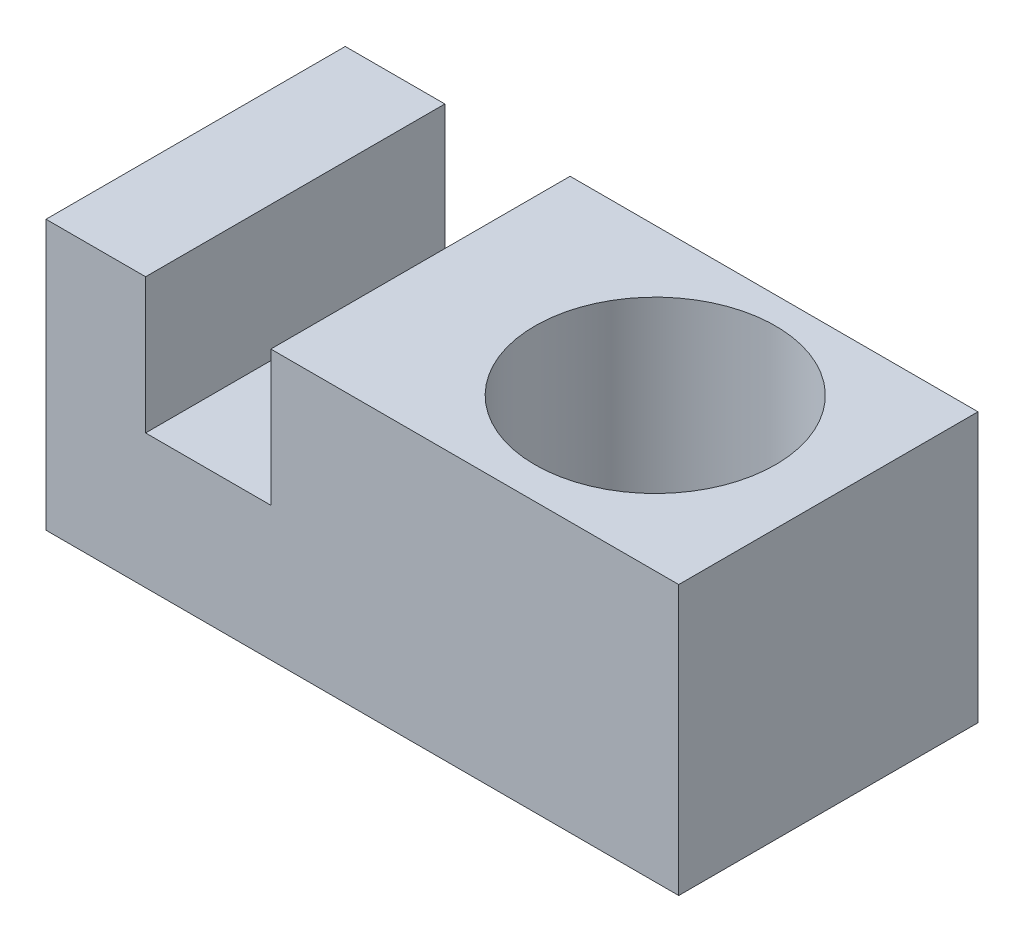
ISO-10303-21;
HEADER;
FILE_DESCRIPTION(('STEP AP214'),'2;1');
FILE_NAME('part.step','',(''),(''),'','','');
FILE_SCHEMA(('AUTOMOTIVE_DESIGN { 1 0 10303 214 1 1 1 1 }'));
ENDSEC;
DATA;
#1=APPLICATION_CONTEXT('core data for automotive mechanical design processes');
#2=APPLICATION_PROTOCOL_DEFINITION('international standard','automotive_design',2000,#1);
#3=PRODUCT_CONTEXT('',#1,'mechanical');
#4=PRODUCT('Part','Part','',(#3));
#5=PRODUCT_RELATED_PRODUCT_CATEGORY('part','',(#4));
#6=PRODUCT_DEFINITION_FORMATION('','',#4);
#7=PRODUCT_DEFINITION_CONTEXT('part definition',#1,'design');
#8=PRODUCT_DEFINITION('design','',#6,#7);
#9=PRODUCT_DEFINITION_SHAPE('','',#8);
#10=(LENGTH_UNIT() NAMED_UNIT(*) SI_UNIT(.MILLI.,.METRE.));
#11=(NAMED_UNIT(*) PLANE_ANGLE_UNIT() SI_UNIT($,.RADIAN.));
#12=(NAMED_UNIT(*) SI_UNIT($,.STERADIAN.) SOLID_ANGLE_UNIT());
#13=UNCERTAINTY_MEASURE_WITH_UNIT(LENGTH_MEASURE(1.E-05),#10,'distance_accuracy_value','');
#14=(GEOMETRIC_REPRESENTATION_CONTEXT(3) GLOBAL_UNCERTAINTY_ASSIGNED_CONTEXT((#13)) GLOBAL_UNIT_ASSIGNED_CONTEXT((#10,
#11,#12)) REPRESENTATION_CONTEXT('',''));
#15=CARTESIAN_POINT('',(0.,0.,0.));
#16=DIRECTION('',(0.,0.,1.));
#17=DIRECTION('',(1.,0.,0.));
#18=AXIS2_PLACEMENT_3D('',#15,#16,#17);
#19=CARTESIAN_POINT('',(0.,18.,0.));
#20=DIRECTION('',(0.,-1.,0.));
#21=DIRECTION('',(0.,0.,-1.));
#22=AXIS2_PLACEMENT_3D('',#19,#20,#21);
#23=PLANE('',#22);
#24=DIRECTION('',(1.,0.,0.));
#25=VECTOR('',#24,1.);
#26=CARTESIAN_POINT('',(0.,18.,0.));
#27=LINE('',#26,#25);
#28=CARTESIAN_POINT('',(0.,18.,0.));
#29=VERTEX_POINT('',#28);
#30=CARTESIAN_POINT('',(6.656095268603,18.,0.));
#31=VERTEX_POINT('',#30);
#32=EDGE_CURVE('E87',#29,#31,#27,.T.);
#33=ORIENTED_EDGE('',*,*,#32,.T.);
#34=DIRECTION('',(0.,0.,1.));
#35=VECTOR('',#34,1.);
#36=CARTESIAN_POINT('',(6.656095268603,18.,-20.));
#37=LINE('',#36,#35);
#38=CARTESIAN_POINT('',(6.656095268603,18.,-20.));
#39=VERTEX_POINT('',#38);
#40=EDGE_CURVE('E135',#39,#31,#37,.T.);
#41=ORIENTED_EDGE('',*,*,#40,.F.);
#42=DIRECTION('',(-1.,0.,0.));
#43=VECTOR('',#42,1.);
#44=CARTESIAN_POINT('',(0.,18.,-20.));
#45=LINE('',#44,#43);
#46=CARTESIAN_POINT('',(0.,18.,-20.));
#47=VERTEX_POINT('',#46);
#48=EDGE_CURVE('E58',#39,#47,#45,.T.);
#49=ORIENTED_EDGE('',*,*,#48,.T.);
#50=DIRECTION('',(0.,0.,1.));
#51=VECTOR('',#50,1.);
#52=CARTESIAN_POINT('',(0.,18.,0.));
#53=LINE('',#52,#51);
#54=EDGE_CURVE('E147',#47,#29,#53,.T.);
#55=ORIENTED_EDGE('',*,*,#54,.T.);
#56=EDGE_LOOP('',(#33,#41,#49,#55));
#57=FACE_BOUND('',#56,.T.);
#58=ADVANCED_FACE('F34',(#57),#23,.F.);
#59=CARTESIAN_POINT('',(0.,18.,0.));
#60=DIRECTION('',(1.,0.,0.));
#61=DIRECTION('',(0.,0.,-1.));
#62=AXIS2_PLACEMENT_3D('',#59,#60,#61);
#63=PLANE('',#62);
#64=DIRECTION('',(0.,0.,1.));
#65=VECTOR('',#64,1.);
#66=CARTESIAN_POINT('',(0.,0.,0.));
#67=LINE('',#66,#65);
#68=CARTESIAN_POINT('',(0.,0.,-20.));
#69=VERTEX_POINT('',#68);
#70=CARTESIAN_POINT('',(0.,0.,0.));
#71=VERTEX_POINT('',#70);
#72=EDGE_CURVE('E144',#69,#71,#67,.T.);
#73=ORIENTED_EDGE('',*,*,#72,.T.);
#74=DIRECTION('',(0.,-1.,0.));
#75=VECTOR('',#74,1.);
#76=CARTESIAN_POINT('',(0.,18.,0.));
#77=LINE('',#76,#75);
#78=EDGE_CURVE('E11',#29,#71,#77,.T.);
#79=ORIENTED_EDGE('',*,*,#78,.F.);
#80=ORIENTED_EDGE('',*,*,#54,.F.);
#81=DIRECTION('',(0.,-1.,0.));
#82=VECTOR('',#81,1.);
#83=CARTESIAN_POINT('',(0.,18.,-20.));
#84=LINE('',#83,#82);
#85=EDGE_CURVE('E156',#47,#69,#84,.T.);
#86=ORIENTED_EDGE('',*,*,#85,.T.);
#87=EDGE_LOOP('',(#73,#79,#80,#86));
#88=FACE_BOUND('',#87,.T.);
#89=ADVANCED_FACE('F36',(#88),#63,.F.);
#90=CARTESIAN_POINT('',(0.,18.,0.));
#91=DIRECTION('',(0.,0.,-1.));
#92=DIRECTION('',(-1.,0.,0.));
#93=AXIS2_PLACEMENT_3D('',#90,#91,#92);
#94=PLANE('',#93);
#95=DIRECTION('',(1.,0.,0.));
#96=VECTOR('',#95,1.);
#97=CARTESIAN_POINT('',(6.656095268603,8.95889217596846,0.));
#98=LINE('',#97,#96);
#99=CARTESIAN_POINT('',(6.656095268603,8.95889217596846,0.));
#100=VERTEX_POINT('',#99);
#101=CARTESIAN_POINT('',(15.0247413303417,8.95889217596846,0.));
#102=VERTEX_POINT('',#101);
#103=EDGE_CURVE('E129',#100,#102,#98,.T.);
#104=ORIENTED_EDGE('',*,*,#103,.F.);
#105=DIRECTION('',(0.,-1.,0.));
#106=VECTOR('',#105,1.);
#107=CARTESIAN_POINT('',(6.656095268603,18.,0.));
#108=LINE('',#107,#106);
#109=EDGE_CURVE('E114',#31,#100,#108,.T.);
#110=ORIENTED_EDGE('',*,*,#109,.F.);
#111=ORIENTED_EDGE('',*,*,#32,.F.);
#112=ORIENTED_EDGE('',*,*,#78,.T.);
#113=DIRECTION('',(1.,0.,0.));
#114=VECTOR('',#113,1.);
#115=CARTESIAN_POINT('',(0.,0.,0.));
#116=LINE('',#115,#114);
#117=CARTESIAN_POINT('',(42.2857142857143,0.,0.));
#118=VERTEX_POINT('',#117);
#119=EDGE_CURVE('E159',#71,#118,#116,.T.);
#120=ORIENTED_EDGE('',*,*,#119,.T.);
#121=DIRECTION('',(0.,-1.,0.));
#122=VECTOR('',#121,1.);
#123=CARTESIAN_POINT('',(42.2857142857143,18.,0.));
#124=LINE('',#123,#122);
#125=CARTESIAN_POINT('',(42.2857142857143,18.,0.));
#126=VERTEX_POINT('',#125);
#127=EDGE_CURVE('E42',#126,#118,#124,.T.);
#128=ORIENTED_EDGE('',*,*,#127,.F.);
#129=CARTESIAN_POINT('',(15.0247413303417,18.,0.));
#130=VERTEX_POINT('',#129);
#131=EDGE_CURVE('E149',#130,#126,#27,.T.);
#132=ORIENTED_EDGE('',*,*,#131,.F.);
#133=DIRECTION('',(0.,1.,0.));
#134=VECTOR('',#133,1.);
#135=CARTESIAN_POINT('',(15.0247413303417,18.,0.));
#136=LINE('',#135,#134);
#137=EDGE_CURVE('E49',#102,#130,#136,.T.);
#138=ORIENTED_EDGE('',*,*,#137,.F.);
#139=EDGE_LOOP('',(#104,#110,#111,#112,#120,#128,#132,#138));
#140=FACE_BOUND('',#139,.T.);
#141=ADVANCED_FACE('F180',(#140),#94,.F.);
#142=CARTESIAN_POINT('',(42.2857142857143,18.,0.));
#143=DIRECTION('',(-1.,0.,0.));
#144=DIRECTION('',(0.,0.,1.));
#145=AXIS2_PLACEMENT_3D('',#142,#143,#144);
#146=PLANE('',#145);
#147=DIRECTION('',(0.,0.,-1.));
#148=VECTOR('',#147,1.);
#149=CARTESIAN_POINT('',(42.2857142857143,0.,0.));
#150=LINE('',#149,#148);
#151=CARTESIAN_POINT('',(42.2857142857143,0.,-20.));
#152=VERTEX_POINT('',#151);
#153=EDGE_CURVE('E161',#118,#152,#150,.T.);
#154=ORIENTED_EDGE('',*,*,#153,.T.);
#155=DIRECTION('',(0.,-1.,0.));
#156=VECTOR('',#155,1.);
#157=CARTESIAN_POINT('',(42.2857142857143,18.,-20.));
#158=LINE('',#157,#156);
#159=CARTESIAN_POINT('',(42.2857142857143,18.,-20.));
#160=VERTEX_POINT('',#159);
#161=EDGE_CURVE('E165',#160,#152,#158,.T.);
#162=ORIENTED_EDGE('',*,*,#161,.F.);
#163=DIRECTION('',(0.,0.,-1.));
#164=VECTOR('',#163,1.);
#165=CARTESIAN_POINT('',(42.2857142857143,18.,0.));
#166=LINE('',#165,#164);
#167=EDGE_CURVE('E151',#126,#160,#166,.T.);
#168=ORIENTED_EDGE('',*,*,#167,.F.);
#169=ORIENTED_EDGE('',*,*,#127,.T.);
#170=EDGE_LOOP('',(#154,#162,#168,#169));
#171=FACE_BOUND('',#170,.T.);
#172=ADVANCED_FACE('F171',(#171),#146,.F.);
#173=CARTESIAN_POINT('',(0.,18.,-20.));
#174=DIRECTION('',(0.,0.,1.));
#175=DIRECTION('',(1.,0.,0.));
#176=AXIS2_PLACEMENT_3D('',#173,#174,#175);
#177=PLANE('',#176);
#178=ORIENTED_EDGE('',*,*,#48,.F.);
#179=DIRECTION('',(0.,-1.,0.));
#180=VECTOR('',#179,1.);
#181=CARTESIAN_POINT('',(6.656095268603,18.,-20.));
#182=LINE('',#181,#180);
#183=CARTESIAN_POINT('',(6.656095268603,8.95889217596846,-20.));
#184=VERTEX_POINT('',#183);
#185=EDGE_CURVE('E113',#39,#184,#182,.T.);
#186=ORIENTED_EDGE('',*,*,#185,.T.);
#187=DIRECTION('',(1.,0.,0.));
#188=VECTOR('',#187,1.);
#189=CARTESIAN_POINT('',(6.656095268603,8.95889217596846,-20.));
#190=LINE('',#189,#188);
#191=CARTESIAN_POINT('',(15.0247413303417,8.95889217596846,-20.));
#192=VERTEX_POINT('',#191);
#193=EDGE_CURVE('E122',#184,#192,#190,.T.);
#194=ORIENTED_EDGE('',*,*,#193,.T.);
#195=DIRECTION('',(0.,1.,0.));
#196=VECTOR('',#195,1.);
#197=CARTESIAN_POINT('',(15.0247413303417,18.,-20.));
#198=LINE('',#197,#196);
#199=CARTESIAN_POINT('',(15.0247413303417,18.,-20.));
#200=VERTEX_POINT('',#199);
#201=EDGE_CURVE('E119',#192,#200,#198,.T.);
#202=ORIENTED_EDGE('',*,*,#201,.T.);
#203=EDGE_CURVE('E153',#160,#200,#45,.T.);
#204=ORIENTED_EDGE('',*,*,#203,.F.);
#205=ORIENTED_EDGE('',*,*,#161,.T.);
#206=DIRECTION('',(-1.,0.,0.));
#207=VECTOR('',#206,1.);
#208=CARTESIAN_POINT('',(0.,0.,-20.));
#209=LINE('',#208,#207);
#210=EDGE_CURVE('E80',#152,#69,#209,.T.);
#211=ORIENTED_EDGE('',*,*,#210,.T.);
#212=ORIENTED_EDGE('',*,*,#85,.F.);
#213=EDGE_LOOP('',(#178,#186,#194,#202,#204,#205,#211,#212));
#214=FACE_BOUND('',#213,.T.);
#215=ADVANCED_FACE('F127',(#214),#177,.F.);
#216=CARTESIAN_POINT('',(30.5494349577149,18.,-10.1657648009876));
#217=DIRECTION('',(0.,1.,0.));
#218=DIRECTION('',(0.,0.,1.));
#219=AXIS2_PLACEMENT_3D('',#216,#217,#218);
#220=CIRCLE('',#219,8.03891695961086);
#221=CARTESIAN_POINT('',(30.5494349577149,18.,-2.12684784137677));
#222=VERTEX_POINT('',#221);
#223=EDGE_CURVE('E137',#222,#222,#220,.T.);
#224=ORIENTED_EDGE('',*,*,#223,.F.);
#225=EDGE_LOOP('',(#224));
#226=FACE_BOUND('',#225,.T.);
#227=ORIENTED_EDGE('',*,*,#203,.T.);
#228=DIRECTION('',(0.,0.,1.));
#229=VECTOR('',#228,1.);
#230=CARTESIAN_POINT('',(15.0247413303417,18.,-20.));
#231=LINE('',#230,#229);
#232=EDGE_CURVE('E138',#200,#130,#231,.T.);
#233=ORIENTED_EDGE('',*,*,#232,.T.);
#234=ORIENTED_EDGE('',*,*,#131,.T.);
#235=ORIENTED_EDGE('',*,*,#167,.T.);
#236=EDGE_LOOP('',(#227,#233,#234,#235));
#237=FACE_BOUND('',#236,.T.);
#238=ADVANCED_FACE('F182',(#226,#237),#23,.F.);
#239=CARTESIAN_POINT('',(0.,0.,0.));
#240=DIRECTION('',(0.,-1.,0.));
#241=DIRECTION('',(0.,0.,-1.));
#242=AXIS2_PLACEMENT_3D('',#239,#240,#241);
#243=PLANE('',#242);
#244=CARTESIAN_POINT('',(30.5494349577149,0.,-10.1657648009876));
#245=DIRECTION('',(0.,1.,0.));
#246=DIRECTION('',(0.,0.,1.));
#247=AXIS2_PLACEMENT_3D('',#244,#245,#246);
#248=CIRCLE('',#247,8.03891695961086);
#249=CARTESIAN_POINT('',(30.5494349577149,0.,-2.12684784137677));
#250=VERTEX_POINT('',#249);
#251=EDGE_CURVE('E141',#250,#250,#248,.T.);
#252=ORIENTED_EDGE('',*,*,#251,.T.);
#253=EDGE_LOOP('',(#252));
#254=FACE_BOUND('',#253,.T.);
#255=ORIENTED_EDGE('',*,*,#72,.F.);
#256=ORIENTED_EDGE('',*,*,#210,.F.);
#257=ORIENTED_EDGE('',*,*,#153,.F.);
#258=ORIENTED_EDGE('',*,*,#119,.F.);
#259=EDGE_LOOP('',(#255,#256,#257,#258));
#260=FACE_BOUND('',#259,.T.);
#261=ADVANCED_FACE('F176',(#254,#260),#243,.T.);
#262=CARTESIAN_POINT('',(30.5494349577149,0.,-10.1657648009876));
#263=DIRECTION('',(0.,1.,0.));
#264=DIRECTION('',(0.,0.,1.));
#265=AXIS2_PLACEMENT_3D('',#262,#263,#264);
#266=CYLINDRICAL_SURFACE('',#265,8.03891695961086);
#267=ORIENTED_EDGE('',*,*,#251,.F.);
#268=EDGE_LOOP('',(#267));
#269=FACE_BOUND('',#268,.T.);
#270=ORIENTED_EDGE('',*,*,#223,.T.);
#271=EDGE_LOOP('',(#270));
#272=FACE_BOUND('',#271,.T.);
#273=ADVANCED_FACE('F192',(#269,#272),#266,.F.);
#274=CARTESIAN_POINT('',(6.656095268603,18.,-20.));
#275=DIRECTION('',(-1.,0.,0.));
#276=DIRECTION('',(0.,0.,1.));
#277=AXIS2_PLACEMENT_3D('',#274,#275,#276);
#278=PLANE('',#277);
#279=ORIENTED_EDGE('',*,*,#109,.T.);
#280=DIRECTION('',(0.,0.,1.));
#281=VECTOR('',#280,1.);
#282=CARTESIAN_POINT('',(6.656095268603,8.95889217596846,-20.));
#283=LINE('',#282,#281);
#284=EDGE_CURVE('E109',#184,#100,#283,.T.);
#285=ORIENTED_EDGE('',*,*,#284,.F.);
#286=ORIENTED_EDGE('',*,*,#185,.F.);
#287=ORIENTED_EDGE('',*,*,#40,.T.);
#288=EDGE_LOOP('',(#279,#285,#286,#287));
#289=FACE_BOUND('',#288,.T.);
#290=ADVANCED_FACE('F111',(#289),#278,.F.);
#291=CARTESIAN_POINT('',(15.0247413303417,18.,-20.));
#292=DIRECTION('',(1.,0.,0.));
#293=DIRECTION('',(0.,0.,-1.));
#294=AXIS2_PLACEMENT_3D('',#291,#292,#293);
#295=PLANE('',#294);
#296=ORIENTED_EDGE('',*,*,#137,.T.);
#297=ORIENTED_EDGE('',*,*,#232,.F.);
#298=ORIENTED_EDGE('',*,*,#201,.F.);
#299=DIRECTION('',(0.,0.,1.));
#300=VECTOR('',#299,1.);
#301=CARTESIAN_POINT('',(15.0247413303417,8.95889217596846,-20.));
#302=LINE('',#301,#300);
#303=EDGE_CURVE('E118',#192,#102,#302,.T.);
#304=ORIENTED_EDGE('',*,*,#303,.T.);
#305=EDGE_LOOP('',(#296,#297,#298,#304));
#306=FACE_BOUND('',#305,.T.);
#307=ADVANCED_FACE('F184',(#306),#295,.F.);
#308=CARTESIAN_POINT('',(6.656095268603,8.95889217596846,-20.));
#309=DIRECTION('',(0.,-1.,0.));
#310=DIRECTION('',(0.,0.,-1.));
#311=AXIS2_PLACEMENT_3D('',#308,#309,#310);
#312=PLANE('',#311);
#313=ORIENTED_EDGE('',*,*,#103,.T.);
#314=ORIENTED_EDGE('',*,*,#303,.F.);
#315=ORIENTED_EDGE('',*,*,#193,.F.);
#316=ORIENTED_EDGE('',*,*,#284,.T.);
#317=EDGE_LOOP('',(#313,#314,#315,#316));
#318=FACE_BOUND('',#317,.T.);
#319=ADVANCED_FACE('F123',(#318),#312,.F.);
#320=CLOSED_SHELL('',(#58,#89,#141,#172,#215,#238,#261,#273,#290,#307,#319));
#321=MANIFOLD_SOLID_BREP('B2',#320);
#322=ADVANCED_BREP_SHAPE_REPRESENTATION('',(#18,#321),#14);
#323=SHAPE_DEFINITION_REPRESENTATION(#9,#322);
ENDSEC;
END-ISO-10303-21;
